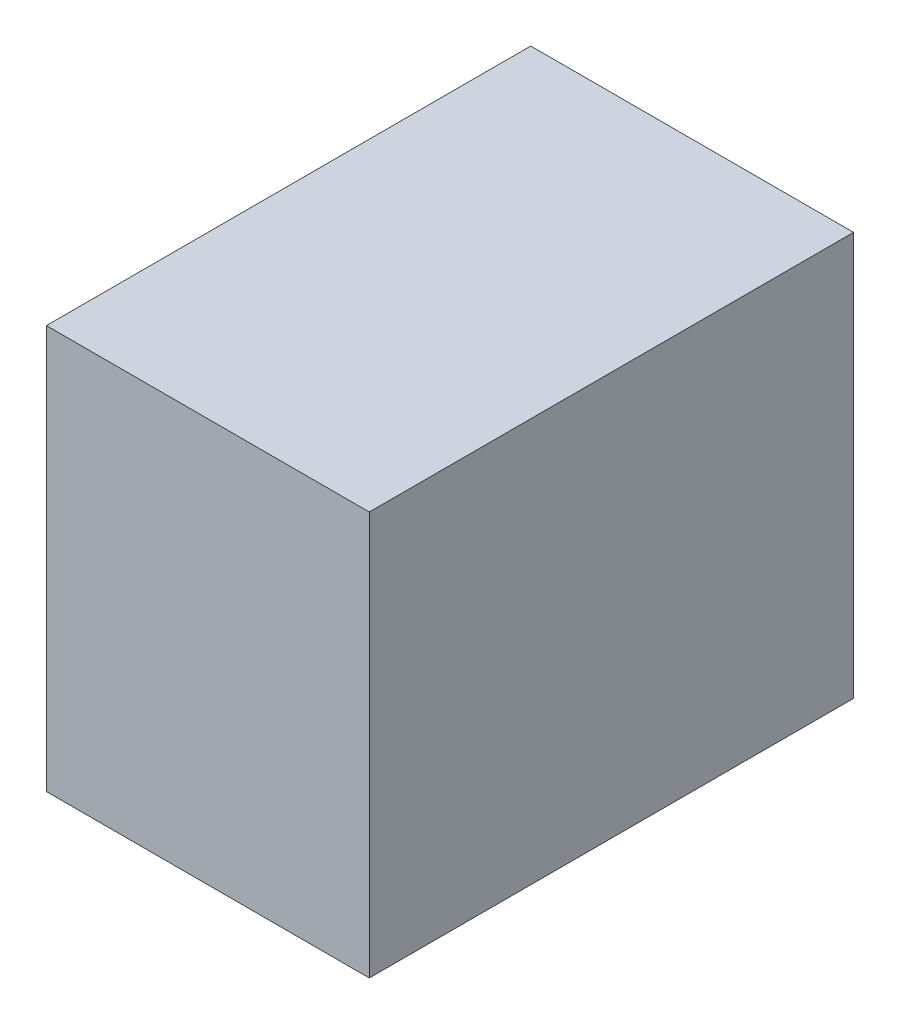
ISO-10303-21;
HEADER;
FILE_DESCRIPTION(('STEP AP214'),'2;1');
FILE_NAME('part.step','',(''),(''),'','','');
FILE_SCHEMA(('AUTOMOTIVE_DESIGN { 1 0 10303 214 1 1 1 1 }'));
ENDSEC;
DATA;
#1=APPLICATION_CONTEXT('core data for automotive mechanical design processes');
#2=APPLICATION_PROTOCOL_DEFINITION('international standard','automotive_design',2000,#1);
#3=PRODUCT_CONTEXT('',#1,'mechanical');
#4=PRODUCT('Part','Part','',(#3));
#5=PRODUCT_RELATED_PRODUCT_CATEGORY('part','',(#4));
#6=PRODUCT_DEFINITION_FORMATION('','',#4);
#7=PRODUCT_DEFINITION_CONTEXT('part definition',#1,'design');
#8=PRODUCT_DEFINITION('design','',#6,#7);
#9=PRODUCT_DEFINITION_SHAPE('','',#8);
#10=(LENGTH_UNIT() NAMED_UNIT(*) SI_UNIT(.MILLI.,.METRE.));
#11=(NAMED_UNIT(*) PLANE_ANGLE_UNIT() SI_UNIT($,.RADIAN.));
#12=(NAMED_UNIT(*) SI_UNIT($,.STERADIAN.) SOLID_ANGLE_UNIT());
#13=UNCERTAINTY_MEASURE_WITH_UNIT(LENGTH_MEASURE(1.E-05),#10,'distance_accuracy_value','');
#14=(GEOMETRIC_REPRESENTATION_CONTEXT(3) GLOBAL_UNCERTAINTY_ASSIGNED_CONTEXT((#13)) GLOBAL_UNIT_ASSIGNED_CONTEXT((#10,
#11,#12)) REPRESENTATION_CONTEXT('',''));
#15=CARTESIAN_POINT('',(0.,0.,0.));
#16=DIRECTION('',(0.,0.,1.));
#17=DIRECTION('',(1.,0.,0.));
#18=AXIS2_PLACEMENT_3D('',#15,#16,#17);
#19=CARTESIAN_POINT('',(-101.6,-127.,304.8));
#20=DIRECTION('',(1.,0.,0.));
#21=DIRECTION('',(0.,0.,-1.));
#22=AXIS2_PLACEMENT_3D('',#19,#20,#21);
#23=PLANE('',#22);
#24=DIRECTION('',(0.,-1.,0.));
#25=VECTOR('',#24,1.);
#26=CARTESIAN_POINT('',(-101.6,-127.,0.));
#27=LINE('',#26,#25);
#28=CARTESIAN_POINT('',(-101.6,127.,0.));
#29=VERTEX_POINT('',#28);
#30=CARTESIAN_POINT('',(-101.6,-127.,0.));
#31=VERTEX_POINT('',#30);
#32=EDGE_CURVE('E113',#29,#31,#27,.T.);
#33=ORIENTED_EDGE('',*,*,#32,.T.);
#34=DIRECTION('',(0.,0.,-1.));
#35=VECTOR('',#34,1.);
#36=CARTESIAN_POINT('',(-101.6,-127.,304.8));
#37=LINE('',#36,#35);
#38=CARTESIAN_POINT('',(-101.6,-127.,304.8));
#39=VERTEX_POINT('',#38);
#40=EDGE_CURVE('E11',#39,#31,#37,.T.);
#41=ORIENTED_EDGE('',*,*,#40,.F.);
#42=DIRECTION('',(0.,-1.,0.));
#43=VECTOR('',#42,1.);
#44=CARTESIAN_POINT('',(-101.6,-127.,304.8));
#45=LINE('',#44,#43);
#46=CARTESIAN_POINT('',(-101.6,127.,304.8));
#47=VERTEX_POINT('',#46);
#48=EDGE_CURVE('E97',#47,#39,#45,.T.);
#49=ORIENTED_EDGE('',*,*,#48,.F.);
#50=DIRECTION('',(0.,0.,-1.));
#51=VECTOR('',#50,1.);
#52=CARTESIAN_POINT('',(-101.6,127.,304.8));
#53=LINE('',#52,#51);
#54=EDGE_CURVE('E109',#47,#29,#53,.T.);
#55=ORIENTED_EDGE('',*,*,#54,.T.);
#56=EDGE_LOOP('',(#33,#41,#49,#55));
#57=FACE_BOUND('',#56,.T.);
#58=ADVANCED_FACE('F45',(#57),#23,.F.);
#59=CARTESIAN_POINT('',(101.6,-127.,304.8));
#60=DIRECTION('',(0.,1.,0.));
#61=DIRECTION('',(-1.,0.,0.));
#62=AXIS2_PLACEMENT_3D('',#59,#60,#61);
#63=PLANE('',#62);
#64=DIRECTION('',(1.,0.,0.));
#65=VECTOR('',#64,1.);
#66=CARTESIAN_POINT('',(101.6,-127.,0.));
#67=LINE('',#66,#65);
#68=CARTESIAN_POINT('',(101.6,-127.,0.));
#69=VERTEX_POINT('',#68);
#70=EDGE_CURVE('E102',#31,#69,#67,.T.);
#71=ORIENTED_EDGE('',*,*,#70,.T.);
#72=DIRECTION('',(0.,0.,-1.));
#73=VECTOR('',#72,1.);
#74=CARTESIAN_POINT('',(101.6,-127.,304.8));
#75=LINE('',#74,#73);
#76=CARTESIAN_POINT('',(101.6,-127.,304.8));
#77=VERTEX_POINT('',#76);
#78=EDGE_CURVE('E54',#77,#69,#75,.T.);
#79=ORIENTED_EDGE('',*,*,#78,.F.);
#80=DIRECTION('',(1.,0.,0.));
#81=VECTOR('',#80,1.);
#82=CARTESIAN_POINT('',(101.6,-127.,304.8));
#83=LINE('',#82,#81);
#84=EDGE_CURVE('E92',#39,#77,#83,.T.);
#85=ORIENTED_EDGE('',*,*,#84,.F.);
#86=ORIENTED_EDGE('',*,*,#40,.T.);
#87=EDGE_LOOP('',(#71,#79,#85,#86));
#88=FACE_BOUND('',#87,.T.);
#89=ADVANCED_FACE('F101',(#88),#63,.F.);
#90=CARTESIAN_POINT('',(101.6,-127.,304.8));
#91=DIRECTION('',(-1.,0.,0.));
#92=DIRECTION('',(0.,-1.,0.));
#93=AXIS2_PLACEMENT_3D('',#90,#91,#92);
#94=PLANE('',#93);
#95=DIRECTION('',(0.,1.,0.));
#96=VECTOR('',#95,1.);
#97=CARTESIAN_POINT('',(101.6,-127.,0.));
#98=LINE('',#97,#96);
#99=CARTESIAN_POINT('',(101.6,127.,0.));
#100=VERTEX_POINT('',#99);
#101=EDGE_CURVE('E79',#69,#100,#98,.T.);
#102=ORIENTED_EDGE('',*,*,#101,.T.);
#103=DIRECTION('',(0.,0.,-1.));
#104=VECTOR('',#103,1.);
#105=CARTESIAN_POINT('',(101.6,127.,304.8));
#106=LINE('',#105,#104);
#107=CARTESIAN_POINT('',(101.6,127.,304.8));
#108=VERTEX_POINT('',#107);
#109=EDGE_CURVE('E104',#108,#100,#106,.T.);
#110=ORIENTED_EDGE('',*,*,#109,.F.);
#111=DIRECTION('',(0.,1.,0.));
#112=VECTOR('',#111,1.);
#113=CARTESIAN_POINT('',(101.6,-127.,304.8));
#114=LINE('',#113,#112);
#115=EDGE_CURVE('E95',#77,#108,#114,.T.);
#116=ORIENTED_EDGE('',*,*,#115,.F.);
#117=ORIENTED_EDGE('',*,*,#78,.T.);
#118=EDGE_LOOP('',(#102,#110,#116,#117));
#119=FACE_BOUND('',#118,.T.);
#120=ADVANCED_FACE('F105',(#119),#94,.F.);
#121=CARTESIAN_POINT('',(101.6,127.,304.8));
#122=DIRECTION('',(0.,-1.,0.));
#123=DIRECTION('',(1.,0.,0.));
#124=AXIS2_PLACEMENT_3D('',#121,#122,#123);
#125=PLANE('',#124);
#126=DIRECTION('',(-1.,0.,0.));
#127=VECTOR('',#126,1.);
#128=CARTESIAN_POINT('',(101.6,127.,0.));
#129=LINE('',#128,#127);
#130=EDGE_CURVE('E85',#100,#29,#129,.T.);
#131=ORIENTED_EDGE('',*,*,#130,.T.);
#132=ORIENTED_EDGE('',*,*,#54,.F.);
#133=DIRECTION('',(-1.,0.,0.));
#134=VECTOR('',#133,1.);
#135=CARTESIAN_POINT('',(101.6,127.,304.8));
#136=LINE('',#135,#134);
#137=EDGE_CURVE('E62',#108,#47,#136,.T.);
#138=ORIENTED_EDGE('',*,*,#137,.F.);
#139=ORIENTED_EDGE('',*,*,#109,.T.);
#140=EDGE_LOOP('',(#131,#132,#138,#139));
#141=FACE_BOUND('',#140,.T.);
#142=ADVANCED_FACE('F126',(#141),#125,.F.);
#143=CARTESIAN_POINT('',(0.,0.,304.8));
#144=DIRECTION('',(0.,0.,1.));
#145=DIRECTION('',(1.,0.,0.));
#146=AXIS2_PLACEMENT_3D('',#143,#144,#145);
#147=PLANE('',#146);
#148=ORIENTED_EDGE('',*,*,#48,.T.);
#149=ORIENTED_EDGE('',*,*,#84,.T.);
#150=ORIENTED_EDGE('',*,*,#115,.T.);
#151=ORIENTED_EDGE('',*,*,#137,.T.);
#152=EDGE_LOOP('',(#148,#149,#150,#151));
#153=FACE_BOUND('',#152,.T.);
#154=ADVANCED_FACE('F93',(#153),#147,.T.);
#155=CARTESIAN_POINT('',(0.,0.,0.));
#156=DIRECTION('',(0.,0.,1.));
#157=DIRECTION('',(1.,0.,0.));
#158=AXIS2_PLACEMENT_3D('',#155,#156,#157);
#159=PLANE('',#158);
#160=ORIENTED_EDGE('',*,*,#32,.F.);
#161=ORIENTED_EDGE('',*,*,#130,.F.);
#162=ORIENTED_EDGE('',*,*,#101,.F.);
#163=ORIENTED_EDGE('',*,*,#70,.F.);
#164=EDGE_LOOP('',(#160,#161,#162,#163));
#165=FACE_BOUND('',#164,.T.);
#166=ADVANCED_FACE('F129',(#165),#159,.F.);
#167=CLOSED_SHELL('',(#58,#89,#120,#142,#154,#166));
#168=MANIFOLD_SOLID_BREP('B2',#167);
#169=ADVANCED_BREP_SHAPE_REPRESENTATION('',(#18,#168),#14);
#170=SHAPE_DEFINITION_REPRESENTATION(#9,#169);
ENDSEC;
END-ISO-10303-21;
